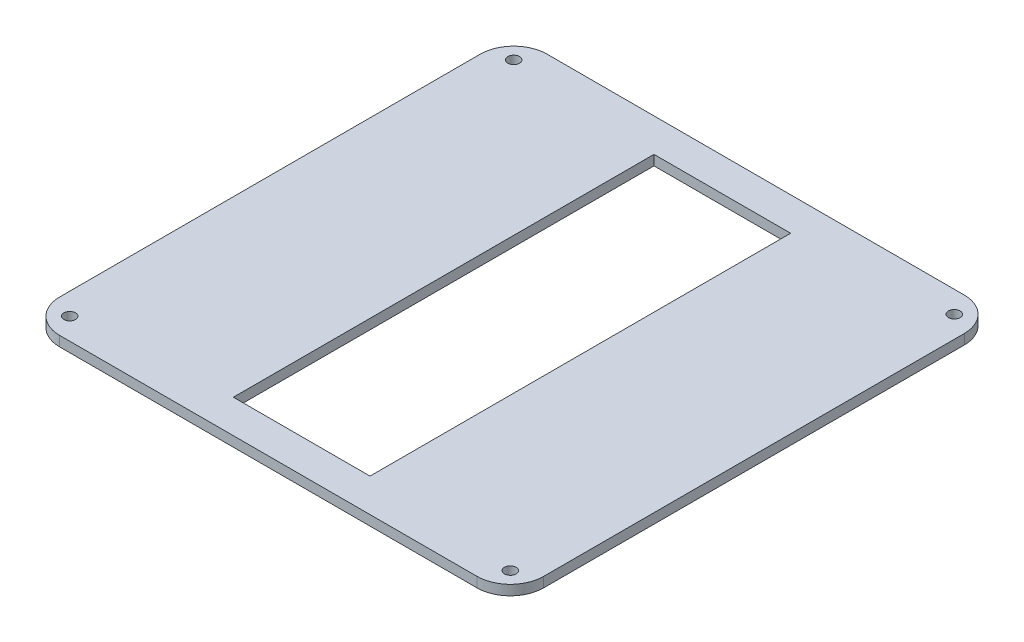
ISO-10303-21;
HEADER;
FILE_DESCRIPTION(('STEP AP214'),'2;1');
FILE_NAME('part.step','',(''),(''),'','','');
FILE_SCHEMA(('AUTOMOTIVE_DESIGN { 1 0 10303 214 1 1 1 1 }'));
ENDSEC;
DATA;
#1=APPLICATION_CONTEXT('core data for automotive mechanical design processes');
#2=APPLICATION_PROTOCOL_DEFINITION('international standard','automotive_design',2000,#1);
#3=PRODUCT_CONTEXT('',#1,'mechanical');
#4=PRODUCT('Part','Part','',(#3));
#5=PRODUCT_RELATED_PRODUCT_CATEGORY('part','',(#4));
#6=PRODUCT_DEFINITION_FORMATION('','',#4);
#7=PRODUCT_DEFINITION_CONTEXT('part definition',#1,'design');
#8=PRODUCT_DEFINITION('design','',#6,#7);
#9=PRODUCT_DEFINITION_SHAPE('','',#8);
#10=(LENGTH_UNIT() NAMED_UNIT(*) SI_UNIT(.MILLI.,.METRE.));
#11=(NAMED_UNIT(*) PLANE_ANGLE_UNIT() SI_UNIT($,.RADIAN.));
#12=(NAMED_UNIT(*) SI_UNIT($,.STERADIAN.) SOLID_ANGLE_UNIT());
#13=UNCERTAINTY_MEASURE_WITH_UNIT(LENGTH_MEASURE(1.E-05),#10,'distance_accuracy_value','');
#14=(GEOMETRIC_REPRESENTATION_CONTEXT(3) GLOBAL_UNCERTAINTY_ASSIGNED_CONTEXT((#13)) GLOBAL_UNIT_ASSIGNED_CONTEXT((#10,
#11,#12)) REPRESENTATION_CONTEXT('',''));
#15=CARTESIAN_POINT('',(0.,0.,0.));
#16=DIRECTION('',(0.,0.,1.));
#17=DIRECTION('',(1.,0.,0.));
#18=AXIS2_PLACEMENT_3D('',#15,#16,#17);
#19=CARTESIAN_POINT('',(-62.6,3.,63.1));
#20=DIRECTION('',(0.,1.,0.));
#21=DIRECTION('',(0.,0.,1.));
#22=AXIS2_PLACEMENT_3D('',#19,#20,#21);
#23=PLANE('',#22);
#24=CARTESIAN_POINT('',(66.1,3.,66.6));
#25=DIRECTION('',(0.,1.,0.));
#26=DIRECTION('',(0.,0.,1.));
#27=AXIS2_PLACEMENT_3D('',#24,#25,#26);
#28=CIRCLE('',#27,1.75);
#29=CARTESIAN_POINT('',(66.1,3.,68.35));
#30=VERTEX_POINT('',#29);
#31=EDGE_CURVE('E185',#30,#30,#28,.T.);
#32=ORIENTED_EDGE('',*,*,#31,.F.);
#33=EDGE_LOOP('',(#32));
#34=FACE_BOUND('',#33,.T.);
#35=CARTESIAN_POINT('',(-66.1,3.,-66.6));
#36=DIRECTION('',(0.,1.,0.));
#37=DIRECTION('',(0.,0.,1.));
#38=AXIS2_PLACEMENT_3D('',#35,#36,#37);
#39=CIRCLE('',#38,1.75);
#40=CARTESIAN_POINT('',(-66.1,3.,-64.85));
#41=VERTEX_POINT('',#40);
#42=EDGE_CURVE('E201',#41,#41,#39,.T.);
#43=ORIENTED_EDGE('',*,*,#42,.F.);
#44=EDGE_LOOP('',(#43));
#45=FACE_BOUND('',#44,.T.);
#46=CARTESIAN_POINT('',(-62.6,3.,63.1));
#47=DIRECTION('',(0.,1.,0.));
#48=DIRECTION('',(0.,0.,1.));
#49=AXIS2_PLACEMENT_3D('',#46,#47,#48);
#50=CIRCLE('',#49,10.);
#51=CARTESIAN_POINT('',(-72.6,3.,63.1));
#52=VERTEX_POINT('',#51);
#53=CARTESIAN_POINT('',(-62.6,3.,73.1));
#54=VERTEX_POINT('',#53);
#55=EDGE_CURVE('E209',#52,#54,#50,.T.);
#56=ORIENTED_EDGE('',*,*,#55,.T.);
#57=DIRECTION('',(1.,0.,0.));
#58=VECTOR('',#57,1.);
#59=CARTESIAN_POINT('',(-62.6,3.,73.1));
#60=LINE('',#59,#58);
#61=CARTESIAN_POINT('',(62.6,3.,73.1));
#62=VERTEX_POINT('',#61);
#63=EDGE_CURVE('E213',#54,#62,#60,.T.);
#64=ORIENTED_EDGE('',*,*,#63,.T.);
#65=CARTESIAN_POINT('',(62.6,3.,63.1));
#66=DIRECTION('',(0.,1.,0.));
#67=DIRECTION('',(0.,0.,1.));
#68=AXIS2_PLACEMENT_3D('',#65,#66,#67);
#69=CIRCLE('',#68,9.99999999999999);
#70=CARTESIAN_POINT('',(72.6,3.,63.1));
#71=VERTEX_POINT('',#70);
#72=EDGE_CURVE('E217',#62,#71,#69,.T.);
#73=ORIENTED_EDGE('',*,*,#72,.T.);
#74=DIRECTION('',(0.,0.,-1.));
#75=VECTOR('',#74,1.);
#76=CARTESIAN_POINT('',(72.6,3.,63.1));
#77=LINE('',#76,#75);
#78=CARTESIAN_POINT('',(72.6,3.,-63.1));
#79=VERTEX_POINT('',#78);
#80=EDGE_CURVE('E220',#71,#79,#77,.T.);
#81=ORIENTED_EDGE('',*,*,#80,.T.);
#82=CARTESIAN_POINT('',(62.6,3.,-63.1));
#83=DIRECTION('',(0.,1.,0.));
#84=DIRECTION('',(0.,0.,1.));
#85=AXIS2_PLACEMENT_3D('',#82,#83,#84);
#86=CIRCLE('',#85,10.);
#87=CARTESIAN_POINT('',(62.6,3.,-73.1));
#88=VERTEX_POINT('',#87);
#89=EDGE_CURVE('E223',#79,#88,#86,.T.);
#90=ORIENTED_EDGE('',*,*,#89,.T.);
#91=DIRECTION('',(-1.,0.,0.));
#92=VECTOR('',#91,1.);
#93=CARTESIAN_POINT('',(-62.6,3.,-73.1));
#94=LINE('',#93,#92);
#95=CARTESIAN_POINT('',(-62.6,3.,-73.1));
#96=VERTEX_POINT('',#95);
#97=EDGE_CURVE('E226',#88,#96,#94,.T.);
#98=ORIENTED_EDGE('',*,*,#97,.T.);
#99=CARTESIAN_POINT('',(-62.6,3.,-63.1));
#100=DIRECTION('',(0.,1.,0.));
#101=DIRECTION('',(0.,0.,1.));
#102=AXIS2_PLACEMENT_3D('',#99,#100,#101);
#103=CIRCLE('',#102,10.);
#104=CARTESIAN_POINT('',(-72.6,3.,-63.1));
#105=VERTEX_POINT('',#104);
#106=EDGE_CURVE('E229',#96,#105,#103,.T.);
#107=ORIENTED_EDGE('',*,*,#106,.T.);
#108=DIRECTION('',(0.,0.,1.));
#109=VECTOR('',#108,1.);
#110=CARTESIAN_POINT('',(-72.6,3.,63.1));
#111=LINE('',#110,#109);
#112=EDGE_CURVE('E232',#105,#52,#111,.T.);
#113=ORIENTED_EDGE('',*,*,#112,.T.);
#114=EDGE_LOOP('',(#56,#64,#73,#81,#90,#98,#107,#113));
#115=FACE_BOUND('',#114,.T.);
#116=CARTESIAN_POINT('',(66.1,3.,-66.6));
#117=DIRECTION('',(0.,1.,0.));
#118=DIRECTION('',(0.,0.,1.));
#119=AXIS2_PLACEMENT_3D('',#116,#117,#118);
#120=CIRCLE('',#119,1.75);
#121=CARTESIAN_POINT('',(66.1,3.,-64.85));
#122=VERTEX_POINT('',#121);
#123=EDGE_CURVE('E193',#122,#122,#120,.T.);
#124=ORIENTED_EDGE('',*,*,#123,.F.);
#125=EDGE_LOOP('',(#124));
#126=FACE_BOUND('',#125,.T.);
#127=CARTESIAN_POINT('',(-66.1,3.,66.6));
#128=DIRECTION('',(0.,1.,0.));
#129=DIRECTION('',(0.,0.,1.));
#130=AXIS2_PLACEMENT_3D('',#127,#128,#129);
#131=CIRCLE('',#130,1.75);
#132=CARTESIAN_POINT('',(-66.1,3.,68.35));
#133=VERTEX_POINT('',#132);
#134=EDGE_CURVE('E177',#133,#133,#131,.T.);
#135=ORIENTED_EDGE('',*,*,#134,.F.);
#136=EDGE_LOOP('',(#135));
#137=FACE_BOUND('',#136,.T.);
#138=DIRECTION('',(1.,0.,0.));
#139=VECTOR('',#138,1.);
#140=CARTESIAN_POINT('',(-20.5,3.,63.1));
#141=LINE('',#140,#139);
#142=CARTESIAN_POINT('',(-20.5,3.,63.1));
#143=VERTEX_POINT('',#142);
#144=CARTESIAN_POINT('',(20.5,3.,63.1));
#145=VERTEX_POINT('',#144);
#146=EDGE_CURVE('E138',#143,#145,#141,.T.);
#147=ORIENTED_EDGE('',*,*,#146,.F.);
#148=DIRECTION('',(0.,0.,1.));
#149=VECTOR('',#148,1.);
#150=CARTESIAN_POINT('',(-20.5,3.,63.1));
#151=LINE('',#150,#149);
#152=CARTESIAN_POINT('',(-20.5,3.,-63.1));
#153=VERTEX_POINT('',#152);
#154=EDGE_CURVE('E129',#153,#143,#151,.T.);
#155=ORIENTED_EDGE('',*,*,#154,.F.);
#156=DIRECTION('',(-1.,0.,0.));
#157=VECTOR('',#156,1.);
#158=CARTESIAN_POINT('',(-20.5,3.,-63.1));
#159=LINE('',#158,#157);
#160=CARTESIAN_POINT('',(20.5,3.,-63.1));
#161=VERTEX_POINT('',#160);
#162=EDGE_CURVE('E155',#161,#153,#159,.T.);
#163=ORIENTED_EDGE('',*,*,#162,.F.);
#164=DIRECTION('',(0.,0.,-1.));
#165=VECTOR('',#164,1.);
#166=CARTESIAN_POINT('',(20.5,3.,63.1));
#167=LINE('',#166,#165);
#168=EDGE_CURVE('E151',#145,#161,#167,.T.);
#169=ORIENTED_EDGE('',*,*,#168,.F.);
#170=EDGE_LOOP('',(#147,#155,#163,#169));
#171=FACE_BOUND('',#170,.T.);
#172=ADVANCED_FACE('F39',(#34,#45,#115,#126,#137,#171),#23,.T.);
#173=CARTESIAN_POINT('',(-62.6,0.,63.1));
#174=DIRECTION('',(0.,1.,0.));
#175=DIRECTION('',(0.,0.,1.));
#176=AXIS2_PLACEMENT_3D('',#173,#174,#175);
#177=PLANE('',#176);
#178=CARTESIAN_POINT('',(-66.1,0.,66.6));
#179=DIRECTION('',(0.,1.,0.));
#180=DIRECTION('',(0.,0.,1.));
#181=AXIS2_PLACEMENT_3D('',#178,#179,#180);
#182=CIRCLE('',#181,1.75);
#183=CARTESIAN_POINT('',(-66.1,0.,68.35));
#184=VERTEX_POINT('',#183);
#185=EDGE_CURVE('E147',#184,#184,#182,.T.);
#186=ORIENTED_EDGE('',*,*,#185,.T.);
#187=EDGE_LOOP('',(#186));
#188=FACE_BOUND('',#187,.T.);
#189=CARTESIAN_POINT('',(66.1,0.,66.6));
#190=DIRECTION('',(0.,1.,0.));
#191=DIRECTION('',(0.,0.,1.));
#192=AXIS2_PLACEMENT_3D('',#189,#190,#191);
#193=CIRCLE('',#192,1.75);
#194=CARTESIAN_POINT('',(66.1,0.,68.35));
#195=VERTEX_POINT('',#194);
#196=EDGE_CURVE('E181',#195,#195,#193,.T.);
#197=ORIENTED_EDGE('',*,*,#196,.T.);
#198=EDGE_LOOP('',(#197));
#199=FACE_BOUND('',#198,.T.);
#200=CARTESIAN_POINT('',(66.1,0.,-66.6));
#201=DIRECTION('',(0.,1.,0.));
#202=DIRECTION('',(0.,0.,1.));
#203=AXIS2_PLACEMENT_3D('',#200,#201,#202);
#204=CIRCLE('',#203,1.75);
#205=CARTESIAN_POINT('',(66.1,0.,-64.85));
#206=VERTEX_POINT('',#205);
#207=EDGE_CURVE('E189',#206,#206,#204,.T.);
#208=ORIENTED_EDGE('',*,*,#207,.T.);
#209=EDGE_LOOP('',(#208));
#210=FACE_BOUND('',#209,.T.);
#211=CARTESIAN_POINT('',(-66.1,0.,-66.6));
#212=DIRECTION('',(0.,1.,0.));
#213=DIRECTION('',(0.,0.,1.));
#214=AXIS2_PLACEMENT_3D('',#211,#212,#213);
#215=CIRCLE('',#214,1.75);
#216=CARTESIAN_POINT('',(-66.1,0.,-64.85));
#217=VERTEX_POINT('',#216);
#218=EDGE_CURVE('E197',#217,#217,#215,.T.);
#219=ORIENTED_EDGE('',*,*,#218,.T.);
#220=EDGE_LOOP('',(#219));
#221=FACE_BOUND('',#220,.T.);
#222=CARTESIAN_POINT('',(-62.6,0.,63.1));
#223=DIRECTION('',(0.,1.,0.));
#224=DIRECTION('',(0.,0.,1.));
#225=AXIS2_PLACEMENT_3D('',#222,#223,#224);
#226=CIRCLE('',#225,10.);
#227=CARTESIAN_POINT('',(-72.6,0.,63.1));
#228=VERTEX_POINT('',#227);
#229=CARTESIAN_POINT('',(-62.6,0.,73.1));
#230=VERTEX_POINT('',#229);
#231=EDGE_CURVE('E205',#228,#230,#226,.T.);
#232=ORIENTED_EDGE('',*,*,#231,.F.);
#233=DIRECTION('',(0.,0.,1.));
#234=VECTOR('',#233,1.);
#235=CARTESIAN_POINT('',(-72.6,0.,63.1));
#236=LINE('',#235,#234);
#237=CARTESIAN_POINT('',(-72.6,0.,-63.1));
#238=VERTEX_POINT('',#237);
#239=EDGE_CURVE('E214',#238,#228,#236,.T.);
#240=ORIENTED_EDGE('',*,*,#239,.F.);
#241=CARTESIAN_POINT('',(-62.6,0.,-63.1));
#242=DIRECTION('',(0.,1.,0.));
#243=DIRECTION('',(0.,0.,1.));
#244=AXIS2_PLACEMENT_3D('',#241,#242,#243);
#245=CIRCLE('',#244,10.);
#246=CARTESIAN_POINT('',(-62.6,0.,-73.1));
#247=VERTEX_POINT('',#246);
#248=EDGE_CURVE('E254',#247,#238,#245,.T.);
#249=ORIENTED_EDGE('',*,*,#248,.F.);
#250=DIRECTION('',(-1.,0.,0.));
#251=VECTOR('',#250,1.);
#252=CARTESIAN_POINT('',(-62.6,0.,-73.1));
#253=LINE('',#252,#251);
#254=CARTESIAN_POINT('',(62.6,0.,-73.1));
#255=VERTEX_POINT('',#254);
#256=EDGE_CURVE('E251',#255,#247,#253,.T.);
#257=ORIENTED_EDGE('',*,*,#256,.F.);
#258=CARTESIAN_POINT('',(62.6,0.,-63.1));
#259=DIRECTION('',(0.,1.,0.));
#260=DIRECTION('',(0.,0.,1.));
#261=AXIS2_PLACEMENT_3D('',#258,#259,#260);
#262=CIRCLE('',#261,10.);
#263=CARTESIAN_POINT('',(72.6,0.,-63.1));
#264=VERTEX_POINT('',#263);
#265=EDGE_CURVE('E248',#264,#255,#262,.T.);
#266=ORIENTED_EDGE('',*,*,#265,.F.);
#267=DIRECTION('',(0.,0.,-1.));
#268=VECTOR('',#267,1.);
#269=CARTESIAN_POINT('',(72.6,0.,63.1));
#270=LINE('',#269,#268);
#271=CARTESIAN_POINT('',(72.6,0.,63.1));
#272=VERTEX_POINT('',#271);
#273=EDGE_CURVE('E245',#272,#264,#270,.T.);
#274=ORIENTED_EDGE('',*,*,#273,.F.);
#275=CARTESIAN_POINT('',(62.6,0.,63.1));
#276=DIRECTION('',(0.,1.,0.));
#277=DIRECTION('',(0.,0.,1.));
#278=AXIS2_PLACEMENT_3D('',#275,#276,#277);
#279=CIRCLE('',#278,9.99999999999999);
#280=CARTESIAN_POINT('',(62.6,0.,73.1));
#281=VERTEX_POINT('',#280);
#282=EDGE_CURVE('E242',#281,#272,#279,.T.);
#283=ORIENTED_EDGE('',*,*,#282,.F.);
#284=DIRECTION('',(1.,0.,0.));
#285=VECTOR('',#284,1.);
#286=CARTESIAN_POINT('',(-62.6,0.,73.1));
#287=LINE('',#286,#285);
#288=EDGE_CURVE('E239',#230,#281,#287,.T.);
#289=ORIENTED_EDGE('',*,*,#288,.F.);
#290=EDGE_LOOP('',(#232,#240,#249,#257,#266,#274,#283,#289));
#291=FACE_BOUND('',#290,.T.);
#292=DIRECTION('',(0.,0.,1.));
#293=VECTOR('',#292,1.);
#294=CARTESIAN_POINT('',(-20.5,0.,63.1));
#295=LINE('',#294,#293);
#296=CARTESIAN_POINT('',(-20.5,0.,-63.1));
#297=VERTEX_POINT('',#296);
#298=CARTESIAN_POINT('',(-20.5,0.,63.1));
#299=VERTEX_POINT('',#298);
#300=EDGE_CURVE('E63',#297,#299,#295,.T.);
#301=ORIENTED_EDGE('',*,*,#300,.T.);
#302=DIRECTION('',(1.,0.,0.));
#303=VECTOR('',#302,1.);
#304=CARTESIAN_POINT('',(-20.5,0.,63.1));
#305=LINE('',#304,#303);
#306=CARTESIAN_POINT('',(20.5,0.,63.1));
#307=VERTEX_POINT('',#306);
#308=EDGE_CURVE('E145',#299,#307,#305,.T.);
#309=ORIENTED_EDGE('',*,*,#308,.T.);
#310=DIRECTION('',(0.,0.,-1.));
#311=VECTOR('',#310,1.);
#312=CARTESIAN_POINT('',(20.5,0.,63.1));
#313=LINE('',#312,#311);
#314=CARTESIAN_POINT('',(20.5,0.,-63.1));
#315=VERTEX_POINT('',#314);
#316=EDGE_CURVE('E164',#307,#315,#313,.T.);
#317=ORIENTED_EDGE('',*,*,#316,.T.);
#318=DIRECTION('',(-1.,0.,0.));
#319=VECTOR('',#318,1.);
#320=CARTESIAN_POINT('',(-20.5,0.,-63.1));
#321=LINE('',#320,#319);
#322=EDGE_CURVE('E139',#315,#297,#321,.T.);
#323=ORIENTED_EDGE('',*,*,#322,.T.);
#324=EDGE_LOOP('',(#301,#309,#317,#323));
#325=FACE_BOUND('',#324,.T.);
#326=ADVANCED_FACE('F293',(#188,#199,#210,#221,#291,#325),#177,.F.);
#327=CARTESIAN_POINT('',(-62.6,3.,63.1));
#328=DIRECTION('',(0.,-1.,0.));
#329=DIRECTION('',(0.,0.,-1.));
#330=AXIS2_PLACEMENT_3D('',#327,#328,#329);
#331=CYLINDRICAL_SURFACE('',#330,10.);
#332=ORIENTED_EDGE('',*,*,#231,.T.);
#333=DIRECTION('',(0.,-1.,0.));
#334=VECTOR('',#333,1.);
#335=CARTESIAN_POINT('',(-62.6,3.,73.1));
#336=LINE('',#335,#334);
#337=EDGE_CURVE('E11',#54,#230,#336,.T.);
#338=ORIENTED_EDGE('',*,*,#337,.F.);
#339=ORIENTED_EDGE('',*,*,#55,.F.);
#340=DIRECTION('',(0.,-1.,0.));
#341=VECTOR('',#340,1.);
#342=CARTESIAN_POINT('',(-72.6,3.,63.1));
#343=LINE('',#342,#341);
#344=EDGE_CURVE('E235',#52,#228,#343,.T.);
#345=ORIENTED_EDGE('',*,*,#344,.T.);
#346=EDGE_LOOP('',(#332,#338,#339,#345));
#347=FACE_BOUND('',#346,.T.);
#348=ADVANCED_FACE('F41',(#347),#331,.T.);
#349=CARTESIAN_POINT('',(-62.6,3.,73.1));
#350=DIRECTION('',(0.,0.,-1.));
#351=DIRECTION('',(-1.,0.,0.));
#352=AXIS2_PLACEMENT_3D('',#349,#350,#351);
#353=PLANE('',#352);
#354=ORIENTED_EDGE('',*,*,#288,.T.);
#355=DIRECTION('',(0.,-1.,0.));
#356=VECTOR('',#355,1.);
#357=CARTESIAN_POINT('',(62.6,3.,73.1));
#358=LINE('',#357,#356);
#359=EDGE_CURVE('E48',#62,#281,#358,.T.);
#360=ORIENTED_EDGE('',*,*,#359,.F.);
#361=ORIENTED_EDGE('',*,*,#63,.F.);
#362=ORIENTED_EDGE('',*,*,#337,.T.);
#363=EDGE_LOOP('',(#354,#360,#361,#362));
#364=FACE_BOUND('',#363,.T.);
#365=ADVANCED_FACE('F311',(#364),#353,.F.);
#366=CARTESIAN_POINT('',(62.6,3.,63.1));
#367=DIRECTION('',(0.,-1.,0.));
#368=DIRECTION('',(0.,0.,-1.));
#369=AXIS2_PLACEMENT_3D('',#366,#367,#368);
#370=CYLINDRICAL_SURFACE('',#369,9.99999999999999);
#371=ORIENTED_EDGE('',*,*,#282,.T.);
#372=DIRECTION('',(0.,-1.,0.));
#373=VECTOR('',#372,1.);
#374=CARTESIAN_POINT('',(72.6,3.,63.1));
#375=LINE('',#374,#373);
#376=EDGE_CURVE('E278',#71,#272,#375,.T.);
#377=ORIENTED_EDGE('',*,*,#376,.F.);
#378=ORIENTED_EDGE('',*,*,#72,.F.);
#379=ORIENTED_EDGE('',*,*,#359,.T.);
#380=EDGE_LOOP('',(#371,#377,#378,#379));
#381=FACE_BOUND('',#380,.T.);
#382=ADVANCED_FACE('F287',(#381),#370,.T.);
#383=CARTESIAN_POINT('',(72.6,3.,63.1));
#384=DIRECTION('',(-1.,0.,0.));
#385=DIRECTION('',(0.,0.,1.));
#386=AXIS2_PLACEMENT_3D('',#383,#384,#385);
#387=PLANE('',#386);
#388=ORIENTED_EDGE('',*,*,#273,.T.);
#389=DIRECTION('',(0.,-1.,0.));
#390=VECTOR('',#389,1.);
#391=CARTESIAN_POINT('',(72.6,3.,-63.1));
#392=LINE('',#391,#390);
#393=EDGE_CURVE('E274',#79,#264,#392,.T.);
#394=ORIENTED_EDGE('',*,*,#393,.F.);
#395=ORIENTED_EDGE('',*,*,#80,.F.);
#396=ORIENTED_EDGE('',*,*,#376,.T.);
#397=EDGE_LOOP('',(#388,#394,#395,#396));
#398=FACE_BOUND('',#397,.T.);
#399=ADVANCED_FACE('F299',(#398),#387,.F.);
#400=CARTESIAN_POINT('',(62.6,3.,-63.1));
#401=DIRECTION('',(0.,-1.,0.));
#402=DIRECTION('',(0.,0.,-1.));
#403=AXIS2_PLACEMENT_3D('',#400,#401,#402);
#404=CYLINDRICAL_SURFACE('',#403,10.);
#405=ORIENTED_EDGE('',*,*,#265,.T.);
#406=DIRECTION('',(0.,-1.,0.));
#407=VECTOR('',#406,1.);
#408=CARTESIAN_POINT('',(62.6,3.,-73.1));
#409=LINE('',#408,#407);
#410=EDGE_CURVE('E270',#88,#255,#409,.T.);
#411=ORIENTED_EDGE('',*,*,#410,.F.);
#412=ORIENTED_EDGE('',*,*,#89,.F.);
#413=ORIENTED_EDGE('',*,*,#393,.T.);
#414=EDGE_LOOP('',(#405,#411,#412,#413));
#415=FACE_BOUND('',#414,.T.);
#416=ADVANCED_FACE('F303',(#415),#404,.T.);
#417=CARTESIAN_POINT('',(-62.6,3.,-73.1));
#418=DIRECTION('',(0.,0.,1.));
#419=DIRECTION('',(1.,0.,0.));
#420=AXIS2_PLACEMENT_3D('',#417,#418,#419);
#421=PLANE('',#420);
#422=ORIENTED_EDGE('',*,*,#256,.T.);
#423=DIRECTION('',(0.,-1.,0.));
#424=VECTOR('',#423,1.);
#425=CARTESIAN_POINT('',(-62.6,3.,-73.1));
#426=LINE('',#425,#424);
#427=EDGE_CURVE('E266',#96,#247,#426,.T.);
#428=ORIENTED_EDGE('',*,*,#427,.F.);
#429=ORIENTED_EDGE('',*,*,#97,.F.);
#430=ORIENTED_EDGE('',*,*,#410,.T.);
#431=EDGE_LOOP('',(#422,#428,#429,#430));
#432=FACE_BOUND('',#431,.T.);
#433=ADVANCED_FACE('F324',(#432),#421,.F.);
#434=CARTESIAN_POINT('',(-62.6,3.,-63.1));
#435=DIRECTION('',(0.,-1.,0.));
#436=DIRECTION('',(0.,0.,-1.));
#437=AXIS2_PLACEMENT_3D('',#434,#435,#436);
#438=CYLINDRICAL_SURFACE('',#437,10.);
#439=ORIENTED_EDGE('',*,*,#248,.T.);
#440=DIRECTION('',(0.,-1.,0.));
#441=VECTOR('',#440,1.);
#442=CARTESIAN_POINT('',(-72.6,3.,-63.1));
#443=LINE('',#442,#441);
#444=EDGE_CURVE('E262',#105,#238,#443,.T.);
#445=ORIENTED_EDGE('',*,*,#444,.F.);
#446=ORIENTED_EDGE('',*,*,#106,.F.);
#447=ORIENTED_EDGE('',*,*,#427,.T.);
#448=EDGE_LOOP('',(#439,#445,#446,#447));
#449=FACE_BOUND('',#448,.T.);
#450=ADVANCED_FACE('F322',(#449),#438,.T.);
#451=CARTESIAN_POINT('',(-72.6,3.,63.1));
#452=DIRECTION('',(1.,0.,0.));
#453=DIRECTION('',(0.,0.,-1.));
#454=AXIS2_PLACEMENT_3D('',#451,#452,#453);
#455=PLANE('',#454);
#456=ORIENTED_EDGE('',*,*,#239,.T.);
#457=ORIENTED_EDGE('',*,*,#344,.F.);
#458=ORIENTED_EDGE('',*,*,#112,.F.);
#459=ORIENTED_EDGE('',*,*,#444,.T.);
#460=EDGE_LOOP('',(#456,#457,#458,#459));
#461=FACE_BOUND('',#460,.T.);
#462=ADVANCED_FACE('F317',(#461),#455,.F.);
#463=CARTESIAN_POINT('',(-66.1,3.,-66.6));
#464=DIRECTION('',(0.,-1.,0.));
#465=DIRECTION('',(0.,0.,-1.));
#466=AXIS2_PLACEMENT_3D('',#463,#464,#465);
#467=CYLINDRICAL_SURFACE('',#466,1.75);
#468=ORIENTED_EDGE('',*,*,#42,.T.);
#469=EDGE_LOOP('',(#468));
#470=FACE_BOUND('',#469,.T.);
#471=ORIENTED_EDGE('',*,*,#218,.F.);
#472=EDGE_LOOP('',(#471));
#473=FACE_BOUND('',#472,.T.);
#474=ADVANCED_FACE('F344',(#470,#473),#467,.F.);
#475=CARTESIAN_POINT('',(66.1,3.,-66.6));
#476=DIRECTION('',(0.,-1.,0.));
#477=DIRECTION('',(0.,0.,-1.));
#478=AXIS2_PLACEMENT_3D('',#475,#476,#477);
#479=CYLINDRICAL_SURFACE('',#478,1.75);
#480=ORIENTED_EDGE('',*,*,#123,.T.);
#481=EDGE_LOOP('',(#480));
#482=FACE_BOUND('',#481,.T.);
#483=ORIENTED_EDGE('',*,*,#207,.F.);
#484=EDGE_LOOP('',(#483));
#485=FACE_BOUND('',#484,.T.);
#486=ADVANCED_FACE('F351',(#482,#485),#479,.F.);
#487=CARTESIAN_POINT('',(66.1,3.,66.6));
#488=DIRECTION('',(0.,-1.,0.));
#489=DIRECTION('',(0.,0.,-1.));
#490=AXIS2_PLACEMENT_3D('',#487,#488,#489);
#491=CYLINDRICAL_SURFACE('',#490,1.75);
#492=ORIENTED_EDGE('',*,*,#31,.T.);
#493=EDGE_LOOP('',(#492));
#494=FACE_BOUND('',#493,.T.);
#495=ORIENTED_EDGE('',*,*,#196,.F.);
#496=EDGE_LOOP('',(#495));
#497=FACE_BOUND('',#496,.T.);
#498=ADVANCED_FACE('F356',(#494,#497),#491,.F.);
#499=CARTESIAN_POINT('',(-66.1,3.,66.6));
#500=DIRECTION('',(0.,-1.,0.));
#501=DIRECTION('',(0.,0.,-1.));
#502=AXIS2_PLACEMENT_3D('',#499,#500,#501);
#503=CYLINDRICAL_SURFACE('',#502,1.75);
#504=ORIENTED_EDGE('',*,*,#134,.T.);
#505=EDGE_LOOP('',(#504));
#506=FACE_BOUND('',#505,.T.);
#507=ORIENTED_EDGE('',*,*,#185,.F.);
#508=EDGE_LOOP('',(#507));
#509=FACE_BOUND('',#508,.T.);
#510=ADVANCED_FACE('F365',(#506,#509),#503,.F.);
#511=CARTESIAN_POINT('',(-20.5,3.,63.1));
#512=DIRECTION('',(1.,0.,0.));
#513=DIRECTION('',(0.,0.,-1.));
#514=AXIS2_PLACEMENT_3D('',#511,#512,#513);
#515=PLANE('',#514);
#516=ORIENTED_EDGE('',*,*,#300,.F.);
#517=DIRECTION('',(0.,-1.,0.));
#518=VECTOR('',#517,1.);
#519=CARTESIAN_POINT('',(-20.5,3.,-63.1));
#520=LINE('',#519,#518);
#521=EDGE_CURVE('E133',#153,#297,#520,.T.);
#522=ORIENTED_EDGE('',*,*,#521,.F.);
#523=ORIENTED_EDGE('',*,*,#154,.T.);
#524=DIRECTION('',(0.,-1.,0.));
#525=VECTOR('',#524,1.);
#526=CARTESIAN_POINT('',(-20.5,3.,63.1));
#527=LINE('',#526,#525);
#528=EDGE_CURVE('E132',#143,#299,#527,.T.);
#529=ORIENTED_EDGE('',*,*,#528,.T.);
#530=EDGE_LOOP('',(#516,#522,#523,#529));
#531=FACE_BOUND('',#530,.T.);
#532=ADVANCED_FACE('F131',(#531),#515,.T.);
#533=CARTESIAN_POINT('',(-20.5,3.,63.1));
#534=DIRECTION('',(0.,0.,-1.));
#535=DIRECTION('',(-1.,0.,0.));
#536=AXIS2_PLACEMENT_3D('',#533,#534,#535);
#537=PLANE('',#536);
#538=ORIENTED_EDGE('',*,*,#308,.F.);
#539=ORIENTED_EDGE('',*,*,#528,.F.);
#540=ORIENTED_EDGE('',*,*,#146,.T.);
#541=DIRECTION('',(0.,-1.,0.));
#542=VECTOR('',#541,1.);
#543=CARTESIAN_POINT('',(20.5,3.,63.1));
#544=LINE('',#543,#542);
#545=EDGE_CURVE('E148',#145,#307,#544,.T.);
#546=ORIENTED_EDGE('',*,*,#545,.T.);
#547=EDGE_LOOP('',(#538,#539,#540,#546));
#548=FACE_BOUND('',#547,.T.);
#549=ADVANCED_FACE('F142',(#548),#537,.T.);
#550=CARTESIAN_POINT('',(20.5,3.,63.1));
#551=DIRECTION('',(-1.,0.,0.));
#552=DIRECTION('',(0.,0.,1.));
#553=AXIS2_PLACEMENT_3D('',#550,#551,#552);
#554=PLANE('',#553);
#555=ORIENTED_EDGE('',*,*,#316,.F.);
#556=ORIENTED_EDGE('',*,*,#545,.F.);
#557=ORIENTED_EDGE('',*,*,#168,.T.);
#558=DIRECTION('',(0.,-1.,0.));
#559=VECTOR('',#558,1.);
#560=CARTESIAN_POINT('',(20.5,3.,-63.1));
#561=LINE('',#560,#559);
#562=EDGE_CURVE('E55',#161,#315,#561,.T.);
#563=ORIENTED_EDGE('',*,*,#562,.T.);
#564=EDGE_LOOP('',(#555,#556,#557,#563));
#565=FACE_BOUND('',#564,.T.);
#566=ADVANCED_FACE('F377',(#565),#554,.T.);
#567=CARTESIAN_POINT('',(-20.5,3.,-63.1));
#568=DIRECTION('',(0.,0.,1.));
#569=DIRECTION('',(1.,0.,0.));
#570=AXIS2_PLACEMENT_3D('',#567,#568,#569);
#571=PLANE('',#570);
#572=ORIENTED_EDGE('',*,*,#322,.F.);
#573=ORIENTED_EDGE('',*,*,#562,.F.);
#574=ORIENTED_EDGE('',*,*,#162,.T.);
#575=ORIENTED_EDGE('',*,*,#521,.T.);
#576=EDGE_LOOP('',(#572,#573,#574,#575));
#577=FACE_BOUND('',#576,.T.);
#578=ADVANCED_FACE('F380',(#577),#571,.T.);
#579=CLOSED_SHELL('',(#172,#326,#348,#365,#382,#399,#416,#433,#450,#462,#474,#486,#498,#510,
#532,#549,#566,#578));
#580=MANIFOLD_SOLID_BREP('B2',#579);
#581=ADVANCED_BREP_SHAPE_REPRESENTATION('',(#18,#580),#14);
#582=SHAPE_DEFINITION_REPRESENTATION(#9,#581);
ENDSEC;
END-ISO-10303-21;
